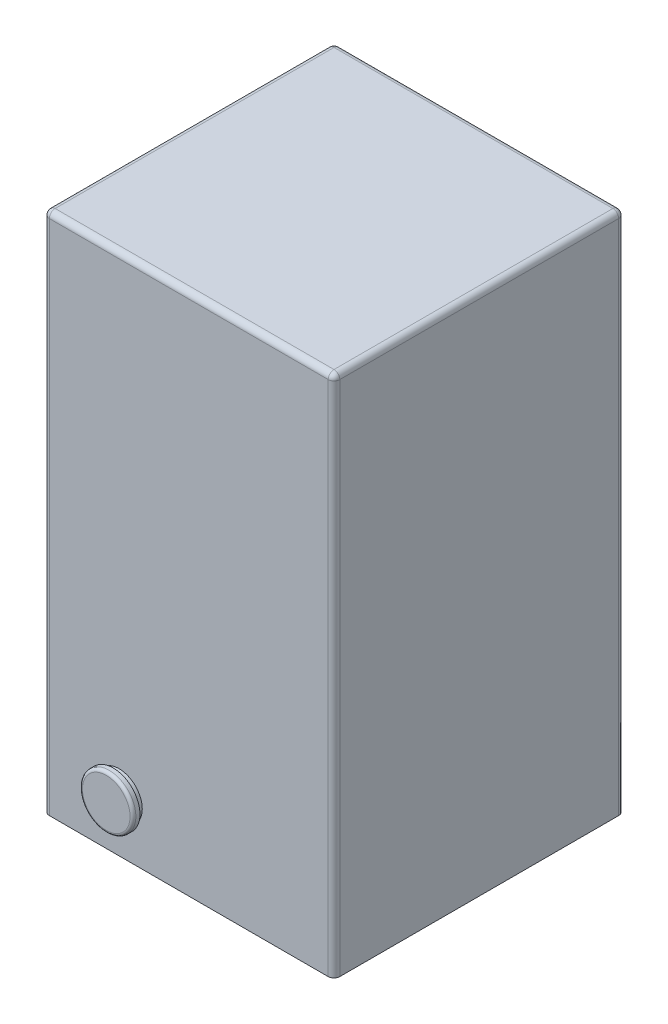
ISO-10303-21;
HEADER;
FILE_DESCRIPTION(('STEP AP214'),'2;1');
FILE_NAME('part.step','',(''),(''),'','','');
FILE_SCHEMA(('AUTOMOTIVE_DESIGN { 1 0 10303 214 1 1 1 1 }'));
ENDSEC;
DATA;
#1=APPLICATION_CONTEXT('core data for automotive mechanical design processes');
#2=APPLICATION_PROTOCOL_DEFINITION('international standard','automotive_design',2000,#1);
#3=PRODUCT_CONTEXT('',#1,'mechanical');
#4=PRODUCT('Part','Part','',(#3));
#5=PRODUCT_RELATED_PRODUCT_CATEGORY('part','',(#4));
#6=PRODUCT_DEFINITION_FORMATION('','',#4);
#7=PRODUCT_DEFINITION_CONTEXT('part definition',#1,'design');
#8=PRODUCT_DEFINITION('design','',#6,#7);
#9=PRODUCT_DEFINITION_SHAPE('','',#8);
#10=(LENGTH_UNIT() NAMED_UNIT(*) SI_UNIT(.MILLI.,.METRE.));
#11=(NAMED_UNIT(*) PLANE_ANGLE_UNIT() SI_UNIT($,.RADIAN.));
#12=(NAMED_UNIT(*) SI_UNIT($,.STERADIAN.) SOLID_ANGLE_UNIT());
#13=UNCERTAINTY_MEASURE_WITH_UNIT(LENGTH_MEASURE(1.E-05),#10,'distance_accuracy_value','');
#14=(GEOMETRIC_REPRESENTATION_CONTEXT(3) GLOBAL_UNCERTAINTY_ASSIGNED_CONTEXT((#13)) GLOBAL_UNIT_ASSIGNED_CONTEXT((#10,
#11,#12)) REPRESENTATION_CONTEXT('',''));
#15=CARTESIAN_POINT('',(0.,0.,0.));
#16=DIRECTION('',(0.,0.,1.));
#17=DIRECTION('',(1.,0.,0.));
#18=AXIS2_PLACEMENT_3D('',#15,#16,#17);
#19=CARTESIAN_POINT('',(130.,-810.,522.));
#20=DIRECTION('',(0.,0.,-1.));
#21=DIRECTION('',(-1.,0.,0.));
#22=AXIS2_PLACEMENT_3D('',#19,#20,#21);
#23=CYLINDRICAL_SURFACE('',#22,40.);
#24=CARTESIAN_POINT('',(130.,-810.,500.));
#25=DIRECTION('',(0.,0.,1.));
#26=DIRECTION('',(1.,0.,0.));
#27=AXIS2_PLACEMENT_3D('',#24,#25,#26);
#28=CIRCLE('',#27,40.);
#29=CARTESIAN_POINT('',(170.,-810.,500.));
#30=VERTEX_POINT('',#29);
#31=EDGE_CURVE('E177',#30,#30,#28,.T.);
#32=ORIENTED_EDGE('',*,*,#31,.T.);
#33=EDGE_LOOP('',(#32));
#34=FACE_BOUND('',#33,.T.);
#35=CARTESIAN_POINT('',(130.,-810.,510.));
#36=DIRECTION('',(0.,0.,1.));
#37=DIRECTION('',(1.,0.,0.));
#38=AXIS2_PLACEMENT_3D('',#35,#36,#37);
#39=CIRCLE('',#38,40.);
#40=CARTESIAN_POINT('',(170.,-810.,510.));
#41=VERTEX_POINT('',#40);
#42=EDGE_CURVE('E172',#41,#41,#39,.T.);
#43=ORIENTED_EDGE('',*,*,#42,.F.);
#44=EDGE_LOOP('',(#43));
#45=FACE_BOUND('',#44,.T.);
#46=ADVANCED_FACE('F36',(#34,#45),#23,.T.);
#47=CARTESIAN_POINT('',(0.,0.,500.));
#48=DIRECTION('',(1.,0.,0.));
#49=DIRECTION('',(0.,1.,0.));
#50=AXIS2_PLACEMENT_3D('',#47,#48,#49);
#51=PLANE('',#50);
#52=DIRECTION('',(0.,0.,-1.));
#53=VECTOR('',#52,1.);
#54=CARTESIAN_POINT('',(0.,-10.,500.));
#55=LINE('',#54,#53);
#56=CARTESIAN_POINT('',(0.,-10.,490.));
#57=VERTEX_POINT('',#56);
#58=CARTESIAN_POINT('',(0.,-10.,10.));
#59=VERTEX_POINT('',#58);
#60=EDGE_CURVE('E137',#57,#59,#55,.T.);
#61=ORIENTED_EDGE('',*,*,#60,.T.);
#62=DIRECTION('',(0.,-1.,0.));
#63=VECTOR('',#62,1.);
#64=CARTESIAN_POINT('',(0.,0.,10.));
#65=LINE('',#64,#63);
#66=CARTESIAN_POINT('',(1.10218211923262E-13,-900.,10.));
#67=VERTEX_POINT('',#66);
#68=EDGE_CURVE('E130',#59,#67,#65,.T.);
#69=ORIENTED_EDGE('',*,*,#68,.T.);
#70=DIRECTION('',(0.,0.,-1.));
#71=VECTOR('',#70,1.);
#72=CARTESIAN_POINT('',(1.10218211923262E-13,-900.,500.));
#73=LINE('',#72,#71);
#74=CARTESIAN_POINT('',(1.10218211923262E-13,-900.,490.));
#75=VERTEX_POINT('',#74);
#76=EDGE_CURVE('E117',#75,#67,#73,.T.);
#77=ORIENTED_EDGE('',*,*,#76,.F.);
#78=DIRECTION('',(0.,-1.,0.));
#79=VECTOR('',#78,1.);
#80=CARTESIAN_POINT('',(0.,0.,490.));
#81=LINE('',#80,#79);
#82=EDGE_CURVE('E127',#75,#57,#81,.F.);
#83=ORIENTED_EDGE('',*,*,#82,.T.);
#84=EDGE_LOOP('',(#61,#69,#77,#83));
#85=FACE_BOUND('',#84,.T.);
#86=ADVANCED_FACE('F126',(#85),#51,.F.);
#87=CARTESIAN_POINT('',(1.10218211923262E-13,-900.,500.));
#88=DIRECTION('',(0.,1.,0.));
#89=DIRECTION('',(0.,0.,1.));
#90=AXIS2_PLACEMENT_3D('',#87,#88,#89);
#91=PLANE('',#90);
#92=ORIENTED_EDGE('',*,*,#76,.T.);
#93=CARTESIAN_POINT('',(10.0000000000001,-900.,10.));
#94=DIRECTION('',(0.,1.,0.));
#95=DIRECTION('',(0.,0.,1.));
#96=AXIS2_PLACEMENT_3D('',#93,#94,#95);
#97=CIRCLE('',#96,10.);
#98=CARTESIAN_POINT('',(10.0000000000001,-900.,0.));
#99=VERTEX_POINT('',#98);
#100=EDGE_CURVE('E145',#67,#99,#97,.F.);
#101=ORIENTED_EDGE('',*,*,#100,.T.);
#102=DIRECTION('',(1.,0.,0.));
#103=VECTOR('',#102,1.);
#104=CARTESIAN_POINT('',(1.10218211923262E-13,-900.,0.));
#105=LINE('',#104,#103);
#106=CARTESIAN_POINT('',(490.,-900.,0.));
#107=VERTEX_POINT('',#106);
#108=EDGE_CURVE('E207',#99,#107,#105,.T.);
#109=ORIENTED_EDGE('',*,*,#108,.T.);
#110=CARTESIAN_POINT('',(490.,-900.,10.));
#111=DIRECTION('',(0.,1.,0.));
#112=DIRECTION('',(0.,0.,1.));
#113=AXIS2_PLACEMENT_3D('',#110,#111,#112);
#114=CIRCLE('',#113,10.);
#115=CARTESIAN_POINT('',(500.,-900.,10.));
#116=VERTEX_POINT('',#115);
#117=EDGE_CURVE('E121',#107,#116,#114,.F.);
#118=ORIENTED_EDGE('',*,*,#117,.T.);
#119=DIRECTION('',(0.,0.,-1.));
#120=VECTOR('',#119,1.);
#121=CARTESIAN_POINT('',(500.,-900.,500.));
#122=LINE('',#121,#120);
#123=CARTESIAN_POINT('',(500.,-900.,490.));
#124=VERTEX_POINT('',#123);
#125=EDGE_CURVE('E131',#124,#116,#122,.T.);
#126=ORIENTED_EDGE('',*,*,#125,.F.);
#127=CARTESIAN_POINT('',(490.,-900.,490.));
#128=DIRECTION('',(0.,1.,0.));
#129=DIRECTION('',(0.,0.,1.));
#130=AXIS2_PLACEMENT_3D('',#127,#128,#129);
#131=CIRCLE('',#130,10.);
#132=CARTESIAN_POINT('',(490.,-900.,500.));
#133=VERTEX_POINT('',#132);
#134=EDGE_CURVE('E122',#124,#133,#131,.F.);
#135=ORIENTED_EDGE('',*,*,#134,.T.);
#136=DIRECTION('',(1.,0.,0.));
#137=VECTOR('',#136,1.);
#138=CARTESIAN_POINT('',(1.10218211923262E-13,-900.,500.));
#139=LINE('',#138,#137);
#140=CARTESIAN_POINT('',(10.0000000000001,-900.,500.));
#141=VERTEX_POINT('',#140);
#142=EDGE_CURVE('E118',#141,#133,#139,.T.);
#143=ORIENTED_EDGE('',*,*,#142,.F.);
#144=CARTESIAN_POINT('',(10.0000000000001,-900.,490.));
#145=DIRECTION('',(0.,1.,0.));
#146=DIRECTION('',(0.,0.,1.));
#147=AXIS2_PLACEMENT_3D('',#144,#145,#146);
#148=CIRCLE('',#147,10.);
#149=EDGE_CURVE('E114',#141,#75,#148,.F.);
#150=ORIENTED_EDGE('',*,*,#149,.T.);
#151=EDGE_LOOP('',(#92,#101,#109,#118,#126,#135,#143,#150));
#152=FACE_BOUND('',#151,.T.);
#153=ADVANCED_FACE('F116',(#152),#91,.F.);
#154=CARTESIAN_POINT('',(500.,0.,500.));
#155=DIRECTION('',(-1.,0.,0.));
#156=DIRECTION('',(0.,-1.,0.));
#157=AXIS2_PLACEMENT_3D('',#154,#155,#156);
#158=PLANE('',#157);
#159=ORIENTED_EDGE('',*,*,#125,.T.);
#160=DIRECTION('',(0.,1.,0.));
#161=VECTOR('',#160,1.);
#162=CARTESIAN_POINT('',(500.,0.,10.));
#163=LINE('',#162,#161);
#164=CARTESIAN_POINT('',(500.,-10.,10.));
#165=VERTEX_POINT('',#164);
#166=EDGE_CURVE('E166',#116,#165,#163,.T.);
#167=ORIENTED_EDGE('',*,*,#166,.T.);
#168=DIRECTION('',(0.,0.,-1.));
#169=VECTOR('',#168,1.);
#170=CARTESIAN_POINT('',(500.,-10.,500.));
#171=LINE('',#170,#169);
#172=CARTESIAN_POINT('',(500.,-10.,490.));
#173=VERTEX_POINT('',#172);
#174=EDGE_CURVE('E164',#165,#173,#171,.F.);
#175=ORIENTED_EDGE('',*,*,#174,.T.);
#176=DIRECTION('',(0.,1.,0.));
#177=VECTOR('',#176,1.);
#178=CARTESIAN_POINT('',(500.,-900.,490.));
#179=LINE('',#178,#177);
#180=EDGE_CURVE('E162',#173,#124,#179,.F.);
#181=ORIENTED_EDGE('',*,*,#180,.T.);
#182=EDGE_LOOP('',(#159,#167,#175,#181));
#183=FACE_BOUND('',#182,.T.);
#184=ADVANCED_FACE('F245',(#183),#158,.F.);
#185=CARTESIAN_POINT('',(0.,0.,500.));
#186=DIRECTION('',(0.,-1.,0.));
#187=DIRECTION('',(0.,0.,-1.));
#188=AXIS2_PLACEMENT_3D('',#185,#186,#187);
#189=PLANE('',#188);
#190=DIRECTION('',(0.,0.,-1.));
#191=VECTOR('',#190,1.);
#192=CARTESIAN_POINT('',(490.,0.,500.));
#193=LINE('',#192,#191);
#194=CARTESIAN_POINT('',(490.,0.,490.));
#195=VERTEX_POINT('',#194);
#196=CARTESIAN_POINT('',(490.,0.,10.));
#197=VERTEX_POINT('',#196);
#198=EDGE_CURVE('E153',#195,#197,#193,.T.);
#199=ORIENTED_EDGE('',*,*,#198,.T.);
#200=DIRECTION('',(-1.,0.,0.));
#201=VECTOR('',#200,1.);
#202=CARTESIAN_POINT('',(0.,0.,10.));
#203=LINE('',#202,#201);
#204=CARTESIAN_POINT('',(10.,0.,10.));
#205=VERTEX_POINT('',#204);
#206=EDGE_CURVE('E159',#197,#205,#203,.T.);
#207=ORIENTED_EDGE('',*,*,#206,.T.);
#208=DIRECTION('',(0.,0.,-1.));
#209=VECTOR('',#208,1.);
#210=CARTESIAN_POINT('',(10.,0.,500.));
#211=LINE('',#210,#209);
#212=CARTESIAN_POINT('',(10.,0.,490.));
#213=VERTEX_POINT('',#212);
#214=EDGE_CURVE('E157',#205,#213,#211,.F.);
#215=ORIENTED_EDGE('',*,*,#214,.T.);
#216=DIRECTION('',(-1.,0.,0.));
#217=VECTOR('',#216,1.);
#218=CARTESIAN_POINT('',(500.,0.,490.));
#219=LINE('',#218,#217);
#220=EDGE_CURVE('E155',#213,#195,#219,.F.);
#221=ORIENTED_EDGE('',*,*,#220,.T.);
#222=EDGE_LOOP('',(#199,#207,#215,#221));
#223=FACE_BOUND('',#222,.T.);
#224=ADVANCED_FACE('F237',(#223),#189,.F.);
#225=CARTESIAN_POINT('',(0.,0.,500.));
#226=DIRECTION('',(0.,0.,1.));
#227=DIRECTION('',(1.,0.,0.));
#228=AXIS2_PLACEMENT_3D('',#225,#226,#227);
#229=PLANE('',#228);
#230=ORIENTED_EDGE('',*,*,#31,.F.);
#231=EDGE_LOOP('',(#230));
#232=FACE_BOUND('',#231,.T.);
#233=DIRECTION('',(-1.,0.,0.));
#234=VECTOR('',#233,1.);
#235=CARTESIAN_POINT('',(0.,-10.,500.));
#236=LINE('',#235,#234);
#237=CARTESIAN_POINT('',(490.,-10.,500.));
#238=VERTEX_POINT('',#237);
#239=CARTESIAN_POINT('',(10.,-10.,500.));
#240=VERTEX_POINT('',#239);
#241=EDGE_CURVE('E51',#238,#240,#236,.T.);
#242=ORIENTED_EDGE('',*,*,#241,.T.);
#243=DIRECTION('',(0.,-1.,0.));
#244=VECTOR('',#243,1.);
#245=CARTESIAN_POINT('',(10.0000000000001,-900.,500.));
#246=LINE('',#245,#244);
#247=EDGE_CURVE('E170',#240,#141,#246,.T.);
#248=ORIENTED_EDGE('',*,*,#247,.T.);
#249=ORIENTED_EDGE('',*,*,#142,.T.);
#250=DIRECTION('',(0.,1.,0.));
#251=VECTOR('',#250,1.);
#252=CARTESIAN_POINT('',(490.,0.,500.));
#253=LINE('',#252,#251);
#254=EDGE_CURVE('E56',#133,#238,#253,.T.);
#255=ORIENTED_EDGE('',*,*,#254,.T.);
#256=EDGE_LOOP('',(#242,#248,#249,#255));
#257=FACE_BOUND('',#256,.T.);
#258=ADVANCED_FACE('F233',(#232,#257),#229,.T.);
#259=CARTESIAN_POINT('',(0.,0.,0.));
#260=DIRECTION('',(0.,0.,1.));
#261=DIRECTION('',(1.,0.,0.));
#262=AXIS2_PLACEMENT_3D('',#259,#260,#261);
#263=PLANE('',#262);
#264=ORIENTED_EDGE('',*,*,#108,.F.);
#265=DIRECTION('',(0.,-1.,0.));
#266=VECTOR('',#265,1.);
#267=CARTESIAN_POINT('',(10.,0.,0.));
#268=LINE('',#267,#266);
#269=CARTESIAN_POINT('',(10.,-10.,0.));
#270=VERTEX_POINT('',#269);
#271=EDGE_CURVE('E151',#99,#270,#268,.F.);
#272=ORIENTED_EDGE('',*,*,#271,.T.);
#273=DIRECTION('',(-1.,0.,0.));
#274=VECTOR('',#273,1.);
#275=CARTESIAN_POINT('',(0.,-10.,0.));
#276=LINE('',#275,#274);
#277=CARTESIAN_POINT('',(490.,-10.,0.));
#278=VERTEX_POINT('',#277);
#279=EDGE_CURVE('E149',#270,#278,#276,.F.);
#280=ORIENTED_EDGE('',*,*,#279,.T.);
#281=DIRECTION('',(0.,1.,0.));
#282=VECTOR('',#281,1.);
#283=CARTESIAN_POINT('',(490.,0.,0.));
#284=LINE('',#283,#282);
#285=EDGE_CURVE('E147',#278,#107,#284,.F.);
#286=ORIENTED_EDGE('',*,*,#285,.T.);
#287=EDGE_LOOP('',(#264,#272,#280,#286));
#288=FACE_BOUND('',#287,.T.);
#289=ADVANCED_FACE('F236',(#288),#263,.F.);
#290=CARTESIAN_POINT('',(490.,0.,490.));
#291=DIRECTION('',(0.,-1.,0.));
#292=DIRECTION('',(1.,0.,0.));
#293=AXIS2_PLACEMENT_3D('',#290,#291,#292);
#294=CYLINDRICAL_SURFACE('',#293,10.);
#295=CARTESIAN_POINT('',(490.,-10.,490.));
#296=DIRECTION('',(0.,1.,0.));
#297=DIRECTION('',(-1.,0.,0.));
#298=AXIS2_PLACEMENT_3D('',#295,#296,#297);
#299=CIRCLE('',#298,10.);
#300=EDGE_CURVE('E204',#238,#173,#299,.T.);
#301=ORIENTED_EDGE('',*,*,#300,.F.);
#302=ORIENTED_EDGE('',*,*,#254,.F.);
#303=ORIENTED_EDGE('',*,*,#134,.F.);
#304=ORIENTED_EDGE('',*,*,#180,.F.);
#305=EDGE_LOOP('',(#301,#302,#303,#304));
#306=FACE_BOUND('',#305,.T.);
#307=ADVANCED_FACE('F241',(#306),#294,.T.);
#308=CARTESIAN_POINT('',(490.,-10.,490.));
#309=DIRECTION('',(0.,0.,1.));
#310=DIRECTION('',(1.,0.,0.));
#311=AXIS2_PLACEMENT_3D('',#308,#309,#310);
#312=SPHERICAL_SURFACE('',#311,10.);
#313=CARTESIAN_POINT('',(490.,-10.,490.));
#314=DIRECTION('',(1.,0.,0.));
#315=DIRECTION('',(0.,0.,-1.));
#316=AXIS2_PLACEMENT_3D('',#313,#314,#315);
#317=CIRCLE('',#316,10.);
#318=EDGE_CURVE('E198',#238,#195,#317,.F.);
#319=ORIENTED_EDGE('',*,*,#318,.F.);
#320=ORIENTED_EDGE('',*,*,#300,.T.);
#321=CARTESIAN_POINT('',(490.,-10.,490.));
#322=DIRECTION('',(0.,0.,1.));
#323=DIRECTION('',(1.,0.,0.));
#324=AXIS2_PLACEMENT_3D('',#321,#322,#323);
#325=CIRCLE('',#324,10.);
#326=EDGE_CURVE('E201',#195,#173,#325,.F.);
#327=ORIENTED_EDGE('',*,*,#326,.F.);
#328=EDGE_LOOP('',(#319,#320,#327));
#329=FACE_BOUND('',#328,.T.);
#330=ADVANCED_FACE('F290',(#329),#312,.T.);
#331=CARTESIAN_POINT('',(490.,0.,10.));
#332=DIRECTION('',(0.,1.,0.));
#333=DIRECTION('',(-1.,0.,0.));
#334=AXIS2_PLACEMENT_3D('',#331,#332,#333);
#335=CYLINDRICAL_SURFACE('',#334,10.);
#336=ORIENTED_EDGE('',*,*,#117,.F.);
#337=ORIENTED_EDGE('',*,*,#285,.F.);
#338=CARTESIAN_POINT('',(490.,-10.,10.));
#339=DIRECTION('',(0.,1.,0.));
#340=DIRECTION('',(-1.,0.,0.));
#341=AXIS2_PLACEMENT_3D('',#338,#339,#340);
#342=CIRCLE('',#341,10.);
#343=EDGE_CURVE('E195',#165,#278,#342,.T.);
#344=ORIENTED_EDGE('',*,*,#343,.F.);
#345=ORIENTED_EDGE('',*,*,#166,.F.);
#346=EDGE_LOOP('',(#336,#337,#344,#345));
#347=FACE_BOUND('',#346,.T.);
#348=ADVANCED_FACE('F286',(#347),#335,.T.);
#349=CARTESIAN_POINT('',(490.,-10.,500.));
#350=DIRECTION('',(0.,0.,-1.));
#351=DIRECTION('',(-1.,0.,0.));
#352=AXIS2_PLACEMENT_3D('',#349,#350,#351);
#353=CYLINDRICAL_SURFACE('',#352,10.);
#354=ORIENTED_EDGE('',*,*,#326,.T.);
#355=ORIENTED_EDGE('',*,*,#174,.F.);
#356=CARTESIAN_POINT('',(490.,-10.,10.));
#357=DIRECTION('',(0.,0.,-1.));
#358=DIRECTION('',(-1.,0.,0.));
#359=AXIS2_PLACEMENT_3D('',#356,#357,#358);
#360=CIRCLE('',#359,10.);
#361=EDGE_CURVE('E192',#197,#165,#360,.T.);
#362=ORIENTED_EDGE('',*,*,#361,.F.);
#363=ORIENTED_EDGE('',*,*,#198,.F.);
#364=EDGE_LOOP('',(#354,#355,#362,#363));
#365=FACE_BOUND('',#364,.T.);
#366=ADVANCED_FACE('F282',(#365),#353,.T.);
#367=CARTESIAN_POINT('',(0.,-10.,490.));
#368=DIRECTION('',(1.,0.,0.));
#369=DIRECTION('',(0.,0.,-1.));
#370=AXIS2_PLACEMENT_3D('',#367,#368,#369);
#371=CYLINDRICAL_SURFACE('',#370,10.);
#372=ORIENTED_EDGE('',*,*,#318,.T.);
#373=ORIENTED_EDGE('',*,*,#220,.F.);
#374=CARTESIAN_POINT('',(10.,-10.,490.));
#375=DIRECTION('',(-1.,0.,0.));
#376=DIRECTION('',(0.,0.,1.));
#377=AXIS2_PLACEMENT_3D('',#374,#375,#376);
#378=CIRCLE('',#377,10.);
#379=EDGE_CURVE('E189',#240,#213,#378,.T.);
#380=ORIENTED_EDGE('',*,*,#379,.F.);
#381=ORIENTED_EDGE('',*,*,#241,.F.);
#382=EDGE_LOOP('',(#372,#373,#380,#381));
#383=FACE_BOUND('',#382,.T.);
#384=ADVANCED_FACE('F279',(#383),#371,.T.);
#385=CARTESIAN_POINT('',(10.,0.,490.));
#386=DIRECTION('',(0.,1.,0.));
#387=DIRECTION('',(-1.,0.,0.));
#388=AXIS2_PLACEMENT_3D('',#385,#386,#387);
#389=CYLINDRICAL_SURFACE('',#388,10.);
#390=ORIENTED_EDGE('',*,*,#149,.F.);
#391=ORIENTED_EDGE('',*,*,#247,.F.);
#392=CARTESIAN_POINT('',(10.,-10.,490.));
#393=DIRECTION('',(0.,1.,0.));
#394=DIRECTION('',(-1.,0.,0.));
#395=AXIS2_PLACEMENT_3D('',#392,#393,#394);
#396=CIRCLE('',#395,10.);
#397=EDGE_CURVE('E135',#57,#240,#396,.T.);
#398=ORIENTED_EDGE('',*,*,#397,.F.);
#399=ORIENTED_EDGE('',*,*,#82,.F.);
#400=EDGE_LOOP('',(#390,#391,#398,#399));
#401=FACE_BOUND('',#400,.T.);
#402=ADVANCED_FACE('F133',(#401),#389,.T.);
#403=CARTESIAN_POINT('',(490.,-10.,10.));
#404=DIRECTION('',(0.,0.,1.));
#405=DIRECTION('',(1.,0.,0.));
#406=AXIS2_PLACEMENT_3D('',#403,#404,#405);
#407=SPHERICAL_SURFACE('',#406,10.);
#408=ORIENTED_EDGE('',*,*,#361,.T.);
#409=ORIENTED_EDGE('',*,*,#343,.T.);
#410=CARTESIAN_POINT('',(490.,-10.,10.));
#411=DIRECTION('',(1.,0.,0.));
#412=DIRECTION('',(0.,0.,-1.));
#413=AXIS2_PLACEMENT_3D('',#410,#411,#412);
#414=CIRCLE('',#413,10.);
#415=EDGE_CURVE('E185',#197,#278,#414,.F.);
#416=ORIENTED_EDGE('',*,*,#415,.F.);
#417=EDGE_LOOP('',(#408,#409,#416));
#418=FACE_BOUND('',#417,.T.);
#419=ADVANCED_FACE('F272',(#418),#407,.T.);
#420=CARTESIAN_POINT('',(10.,-10.,490.));
#421=DIRECTION('',(0.,0.,1.));
#422=DIRECTION('',(1.,0.,0.));
#423=AXIS2_PLACEMENT_3D('',#420,#421,#422);
#424=SPHERICAL_SURFACE('',#423,10.);
#425=ORIENTED_EDGE('',*,*,#397,.T.);
#426=ORIENTED_EDGE('',*,*,#379,.T.);
#427=CARTESIAN_POINT('',(10.,-10.,490.));
#428=DIRECTION('',(0.,0.,1.));
#429=DIRECTION('',(1.,0.,0.));
#430=AXIS2_PLACEMENT_3D('',#427,#428,#429);
#431=CIRCLE('',#430,10.);
#432=EDGE_CURVE('E182',#57,#213,#431,.F.);
#433=ORIENTED_EDGE('',*,*,#432,.F.);
#434=EDGE_LOOP('',(#425,#426,#433));
#435=FACE_BOUND('',#434,.T.);
#436=ADVANCED_FACE('F268',(#435),#424,.T.);
#437=CARTESIAN_POINT('',(0.,-10.,10.));
#438=DIRECTION('',(-1.,0.,0.));
#439=DIRECTION('',(0.,0.,1.));
#440=AXIS2_PLACEMENT_3D('',#437,#438,#439);
#441=CYLINDRICAL_SURFACE('',#440,10.);
#442=ORIENTED_EDGE('',*,*,#415,.T.);
#443=ORIENTED_EDGE('',*,*,#279,.F.);
#444=CARTESIAN_POINT('',(10.,-10.,10.));
#445=DIRECTION('',(-1.,0.,0.));
#446=DIRECTION('',(0.,0.,1.));
#447=AXIS2_PLACEMENT_3D('',#444,#445,#446);
#448=CIRCLE('',#447,10.);
#449=EDGE_CURVE('E179',#205,#270,#448,.T.);
#450=ORIENTED_EDGE('',*,*,#449,.F.);
#451=ORIENTED_EDGE('',*,*,#206,.F.);
#452=EDGE_LOOP('',(#442,#443,#450,#451));
#453=FACE_BOUND('',#452,.T.);
#454=ADVANCED_FACE('F264',(#453),#441,.T.);
#455=CARTESIAN_POINT('',(10.,-10.,500.));
#456=DIRECTION('',(0.,0.,-1.));
#457=DIRECTION('',(-1.,0.,0.));
#458=AXIS2_PLACEMENT_3D('',#455,#456,#457);
#459=CYLINDRICAL_SURFACE('',#458,10.);
#460=ORIENTED_EDGE('',*,*,#432,.T.);
#461=ORIENTED_EDGE('',*,*,#214,.F.);
#462=CARTESIAN_POINT('',(10.,-10.,10.));
#463=DIRECTION('',(0.,0.,-1.));
#464=DIRECTION('',(-1.,0.,0.));
#465=AXIS2_PLACEMENT_3D('',#462,#463,#464);
#466=CIRCLE('',#465,10.);
#467=EDGE_CURVE('E176',#59,#205,#466,.T.);
#468=ORIENTED_EDGE('',*,*,#467,.F.);
#469=ORIENTED_EDGE('',*,*,#60,.F.);
#470=EDGE_LOOP('',(#460,#461,#468,#469));
#471=FACE_BOUND('',#470,.T.);
#472=ADVANCED_FACE('F260',(#471),#459,.T.);
#473=CARTESIAN_POINT('',(10.,-10.,10.));
#474=DIRECTION('',(0.,0.,1.));
#475=DIRECTION('',(1.,0.,0.));
#476=AXIS2_PLACEMENT_3D('',#473,#474,#475);
#477=SPHERICAL_SURFACE('',#476,10.);
#478=ORIENTED_EDGE('',*,*,#467,.T.);
#479=ORIENTED_EDGE('',*,*,#449,.T.);
#480=CARTESIAN_POINT('',(10.,-10.,10.));
#481=DIRECTION('',(0.,1.,0.));
#482=DIRECTION('',(-1.,0.,0.));
#483=AXIS2_PLACEMENT_3D('',#480,#481,#482);
#484=CIRCLE('',#483,10.);
#485=EDGE_CURVE('E173',#59,#270,#484,.F.);
#486=ORIENTED_EDGE('',*,*,#485,.F.);
#487=EDGE_LOOP('',(#478,#479,#486));
#488=FACE_BOUND('',#487,.T.);
#489=ADVANCED_FACE('F256',(#488),#477,.T.);
#490=CARTESIAN_POINT('',(10.,0.,10.));
#491=DIRECTION('',(0.,-1.,0.));
#492=DIRECTION('',(1.,0.,0.));
#493=AXIS2_PLACEMENT_3D('',#490,#491,#492);
#494=CYLINDRICAL_SURFACE('',#493,10.);
#495=ORIENTED_EDGE('',*,*,#485,.T.);
#496=ORIENTED_EDGE('',*,*,#271,.F.);
#497=ORIENTED_EDGE('',*,*,#100,.F.);
#498=ORIENTED_EDGE('',*,*,#68,.F.);
#499=EDGE_LOOP('',(#495,#496,#497,#498));
#500=FACE_BOUND('',#499,.T.);
#501=ADVANCED_FACE('F252',(#500),#494,.T.);
#502=CARTESIAN_POINT('',(130.,-810.,510.));
#503=DIRECTION('',(0.,0.,1.));
#504=DIRECTION('',(1.,0.,0.));
#505=AXIS2_PLACEMENT_3D('',#502,#503,#504);
#506=CYLINDRICAL_SURFACE('',#505,46.0000000000001);
#507=CARTESIAN_POINT('',(130.,-810.,517.));
#508=DIRECTION('',(0.,0.,1.));
#509=DIRECTION('',(1.,0.,0.));
#510=AXIS2_PLACEMENT_3D('',#507,#508,#509);
#511=CIRCLE('',#510,46.0000000000001);
#512=CARTESIAN_POINT('',(176.,-810.,517.));
#513=VERTEX_POINT('',#512);
#514=EDGE_CURVE('E11',#513,#513,#511,.F.);
#515=ORIENTED_EDGE('',*,*,#514,.T.);
#516=EDGE_LOOP('',(#515));
#517=FACE_BOUND('',#516,.T.);
#518=CARTESIAN_POINT('',(130.,-810.,510.));
#519=DIRECTION('',(0.,0.,1.));
#520=DIRECTION('',(1.,0.,0.));
#521=AXIS2_PLACEMENT_3D('',#518,#519,#520);
#522=CIRCLE('',#521,46.0000000000001);
#523=CARTESIAN_POINT('',(176.,-810.,510.));
#524=VERTEX_POINT('',#523);
#525=EDGE_CURVE('E328',#524,#524,#522,.T.);
#526=ORIENTED_EDGE('',*,*,#525,.T.);
#527=EDGE_LOOP('',(#526));
#528=FACE_BOUND('',#527,.T.);
#529=ADVANCED_FACE('F255',(#517,#528),#506,.T.);
#530=CARTESIAN_POINT('',(130.,-810.,510.));
#531=DIRECTION('',(0.,0.,1.));
#532=DIRECTION('',(1.,0.,0.));
#533=AXIS2_PLACEMENT_3D('',#530,#531,#532);
#534=PLANE('',#533);
#535=ORIENTED_EDGE('',*,*,#42,.T.);
#536=EDGE_LOOP('',(#535));
#537=FACE_BOUND('',#536,.T.);
#538=ORIENTED_EDGE('',*,*,#525,.F.);
#539=EDGE_LOOP('',(#538));
#540=FACE_BOUND('',#539,.T.);
#541=ADVANCED_FACE('F219',(#537,#540),#534,.F.);
#542=CARTESIAN_POINT('',(130.,-810.,522.));
#543=DIRECTION('',(0.,0.,1.));
#544=DIRECTION('',(1.,0.,0.));
#545=AXIS2_PLACEMENT_3D('',#542,#543,#544);
#546=PLANE('',#545);
#547=CARTESIAN_POINT('',(130.,-810.,522.));
#548=DIRECTION('',(0.,0.,1.));
#549=DIRECTION('',(1.,0.,0.));
#550=AXIS2_PLACEMENT_3D('',#547,#548,#549);
#551=CIRCLE('',#550,41.0000000000001);
#552=CARTESIAN_POINT('',(171.,-810.,522.));
#553=VERTEX_POINT('',#552);
#554=EDGE_CURVE('E44',#553,#553,#551,.T.);
#555=ORIENTED_EDGE('',*,*,#554,.T.);
#556=EDGE_LOOP('',(#555));
#557=FACE_BOUND('',#556,.T.);
#558=ADVANCED_FACE('F212',(#557),#546,.T.);
#559=CARTESIAN_POINT('',(130.,-810.,517.));
#560=DIRECTION('',(0.,0.,1.));
#561=DIRECTION('',(1.,0.,0.));
#562=AXIS2_PLACEMENT_3D('',#559,#560,#561);
#563=TOROIDAL_SURFACE('',#562,41.0000000000001,5.);
#564=ORIENTED_EDGE('',*,*,#514,.F.);
#565=EDGE_LOOP('',(#564));
#566=FACE_BOUND('',#565,.T.);
#567=ORIENTED_EDGE('',*,*,#554,.F.);
#568=EDGE_LOOP('',(#567));
#569=FACE_BOUND('',#568,.T.);
#570=ADVANCED_FACE('F38',(#566,#569),#563,.T.);
#571=CLOSED_SHELL('',(#46,#86,#153,#184,#224,#258,#289,#307,#330,#348,#366,#384,#402,#419,#436,
#454,#472,#489,#501,#529,#541,#558,#570));
#572=MANIFOLD_SOLID_BREP('B2',#571);
#573=ADVANCED_BREP_SHAPE_REPRESENTATION('',(#18,#572),#14);
#574=SHAPE_DEFINITION_REPRESENTATION(#9,#573);
ENDSEC;
END-ISO-10303-21;
